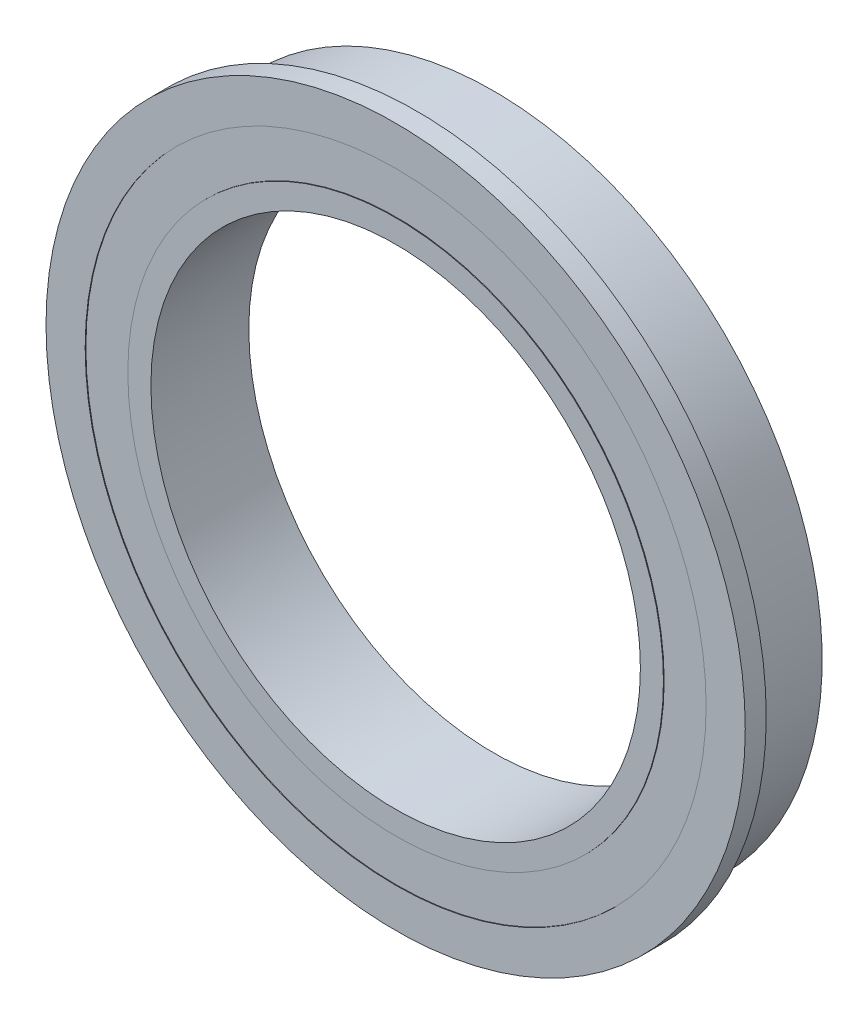
ISO-10303-21;
HEADER;
FILE_DESCRIPTION(('STEP AP214'),'2;1');
FILE_NAME('part.step','',(''),(''),'','','');
FILE_SCHEMA(('AUTOMOTIVE_DESIGN { 1 0 10303 214 1 1 1 1 }'));
ENDSEC;
DATA;
#1=APPLICATION_CONTEXT('core data for automotive mechanical design processes');
#2=APPLICATION_PROTOCOL_DEFINITION('international standard','automotive_design',2000,#1);
#3=PRODUCT_CONTEXT('',#1,'mechanical');
#4=PRODUCT('Part','Part','',(#3));
#5=PRODUCT_RELATED_PRODUCT_CATEGORY('part','',(#4));
#6=PRODUCT_DEFINITION_FORMATION('','',#4);
#7=PRODUCT_DEFINITION_CONTEXT('part definition',#1,'design');
#8=PRODUCT_DEFINITION('design','',#6,#7);
#9=PRODUCT_DEFINITION_SHAPE('','',#8);
#10=(LENGTH_UNIT() NAMED_UNIT(*) SI_UNIT(.MILLI.,.METRE.));
#11=(NAMED_UNIT(*) PLANE_ANGLE_UNIT() SI_UNIT($,.RADIAN.));
#12=(NAMED_UNIT(*) SI_UNIT($,.STERADIAN.) SOLID_ANGLE_UNIT());
#13=UNCERTAINTY_MEASURE_WITH_UNIT(LENGTH_MEASURE(1.E-05),#10,'distance_accuracy_value','');
#14=(GEOMETRIC_REPRESENTATION_CONTEXT(3) GLOBAL_UNCERTAINTY_ASSIGNED_CONTEXT((#13)) GLOBAL_UNIT_ASSIGNED_CONTEXT((#10,
#11,#12)) REPRESENTATION_CONTEXT('',''));
#15=CARTESIAN_POINT('',(0.,0.,0.));
#16=DIRECTION('',(0.,0.,1.));
#17=DIRECTION('',(1.,0.,0.));
#18=AXIS2_PLACEMENT_3D('',#15,#16,#17);
#19=CARTESIAN_POINT('',(0.,0.,0.));
#20=DIRECTION('',(0.,0.,-1.));
#21=DIRECTION('',(-1.,0.,0.));
#22=AXIS2_PLACEMENT_3D('',#19,#20,#21);
#23=CYLINDRICAL_SURFACE('',#22,17.5);
#24=CARTESIAN_POINT('',(0.,0.,7.));
#25=DIRECTION('',(0.,0.,-1.));
#26=DIRECTION('',(-1.,0.,0.));
#27=AXIS2_PLACEMENT_3D('',#24,#25,#26);
#28=CIRCLE('',#27,17.5);
#29=CARTESIAN_POINT('',(-17.5,0.,7.));
#30=VERTEX_POINT('',#29);
#31=EDGE_CURVE('E75',#30,#30,#28,.T.);
#32=ORIENTED_EDGE('',*,*,#31,.F.);
#33=EDGE_LOOP('',(#32));
#34=FACE_BOUND('',#33,.T.);
#35=CARTESIAN_POINT('',(0.,0.,0.));
#36=DIRECTION('',(0.,0.,-1.));
#37=DIRECTION('',(-1.,0.,0.));
#38=AXIS2_PLACEMENT_3D('',#35,#36,#37);
#39=CIRCLE('',#38,17.5);
#40=CARTESIAN_POINT('',(-17.5,0.,0.));
#41=VERTEX_POINT('',#40);
#42=EDGE_CURVE('E10',#41,#41,#39,.T.);
#43=ORIENTED_EDGE('',*,*,#42,.T.);
#44=EDGE_LOOP('',(#43));
#45=FACE_BOUND('',#44,.T.);
#46=ADVANCED_FACE('F15',(#34,#45),#23,.F.);
#47=CARTESIAN_POINT('',(18.325,0.,0.));
#48=DIRECTION('',(0.,0.,1.));
#49=DIRECTION('',(1.,0.,0.));
#50=AXIS2_PLACEMENT_3D('',#47,#48,#49);
#51=PLANE('',#50);
#52=ORIENTED_EDGE('',*,*,#42,.F.);
#53=EDGE_LOOP('',(#52));
#54=FACE_BOUND('',#53,.T.);
#55=CARTESIAN_POINT('',(0.,0.,0.));
#56=DIRECTION('',(0.,0.,-1.));
#57=DIRECTION('',(-1.,0.,0.));
#58=AXIS2_PLACEMENT_3D('',#55,#56,#57);
#59=CIRCLE('',#58,19.15);
#60=CARTESIAN_POINT('',(-19.15,0.,0.));
#61=VERTEX_POINT('',#60);
#62=EDGE_CURVE('E22',#61,#61,#59,.T.);
#63=ORIENTED_EDGE('',*,*,#62,.T.);
#64=EDGE_LOOP('',(#63));
#65=FACE_BOUND('',#64,.T.);
#66=ADVANCED_FACE('F83',(#54,#65),#51,.F.);
#67=CARTESIAN_POINT('',(0.,0.,0.));
#68=DIRECTION('',(0.,0.,-1.));
#69=DIRECTION('',(-1.,0.,0.));
#70=AXIS2_PLACEMENT_3D('',#67,#68,#69);
#71=CYLINDRICAL_SURFACE('',#70,19.15);
#72=ORIENTED_EDGE('',*,*,#62,.F.);
#73=EDGE_LOOP('',(#72));
#74=FACE_BOUND('',#73,.T.);
#75=CARTESIAN_POINT('',(0.,0.,0.0499999999999991));
#76=DIRECTION('',(0.,0.,-1.));
#77=DIRECTION('',(-1.,0.,0.));
#78=AXIS2_PLACEMENT_3D('',#75,#76,#77);
#79=CIRCLE('',#78,19.15);
#80=CARTESIAN_POINT('',(-19.15,0.,0.0499999999999991));
#81=VERTEX_POINT('',#80);
#82=EDGE_CURVE('E30',#81,#81,#79,.T.);
#83=ORIENTED_EDGE('',*,*,#82,.T.);
#84=EDGE_LOOP('',(#83));
#85=FACE_BOUND('',#84,.T.);
#86=ADVANCED_FACE('F87',(#74,#85),#71,.T.);
#87=CARTESIAN_POINT('',(20.675,0.,0.0499999999999993));
#88=DIRECTION('',(0.,0.,1.));
#89=DIRECTION('',(1.,0.,0.));
#90=AXIS2_PLACEMENT_3D('',#87,#88,#89);
#91=PLANE('',#90);
#92=ORIENTED_EDGE('',*,*,#82,.F.);
#93=EDGE_LOOP('',(#92));
#94=FACE_BOUND('',#93,.T.);
#95=CARTESIAN_POINT('',(0.,0.,0.05));
#96=DIRECTION('',(0.,0.,-1.));
#97=DIRECTION('',(-1.,0.,0.));
#98=AXIS2_PLACEMENT_3D('',#95,#96,#97);
#99=CIRCLE('',#98,22.2);
#100=CARTESIAN_POINT('',(-22.2,0.,0.05));
#101=VERTEX_POINT('',#100);
#102=EDGE_CURVE('E36',#101,#101,#99,.T.);
#103=ORIENTED_EDGE('',*,*,#102,.T.);
#104=EDGE_LOOP('',(#103));
#105=FACE_BOUND('',#104,.T.);
#106=ADVANCED_FACE('F91',(#94,#105),#91,.F.);
#107=CARTESIAN_POINT('',(0.,0.,0.));
#108=DIRECTION('',(0.,0.,-1.));
#109=DIRECTION('',(-1.,0.,0.));
#110=AXIS2_PLACEMENT_3D('',#107,#108,#109);
#111=CYLINDRICAL_SURFACE('',#110,22.2);
#112=ORIENTED_EDGE('',*,*,#102,.F.);
#113=EDGE_LOOP('',(#112));
#114=FACE_BOUND('',#113,.T.);
#115=CARTESIAN_POINT('',(0.,0.,0.));
#116=DIRECTION('',(0.,0.,-1.));
#117=DIRECTION('',(-1.,0.,0.));
#118=AXIS2_PLACEMENT_3D('',#115,#116,#117);
#119=CIRCLE('',#118,22.2);
#120=CARTESIAN_POINT('',(-22.2,0.,0.));
#121=VERTEX_POINT('',#120);
#122=EDGE_CURVE('E42',#121,#121,#119,.T.);
#123=ORIENTED_EDGE('',*,*,#122,.T.);
#124=EDGE_LOOP('',(#123));
#125=FACE_BOUND('',#124,.T.);
#126=ADVANCED_FACE('F97',(#114,#125),#111,.F.);
#127=CARTESIAN_POINT('',(22.85,0.,0.));
#128=DIRECTION('',(0.,0.,1.));
#129=DIRECTION('',(1.,0.,0.));
#130=AXIS2_PLACEMENT_3D('',#127,#128,#129);
#131=PLANE('',#130);
#132=ORIENTED_EDGE('',*,*,#122,.F.);
#133=EDGE_LOOP('',(#132));
#134=FACE_BOUND('',#133,.T.);
#135=CARTESIAN_POINT('',(0.,0.,0.));
#136=DIRECTION('',(0.,0.,-1.));
#137=DIRECTION('',(-1.,0.,0.));
#138=AXIS2_PLACEMENT_3D('',#135,#136,#137);
#139=CIRCLE('',#138,23.5);
#140=CARTESIAN_POINT('',(-23.5,0.,0.));
#141=VERTEX_POINT('',#140);
#142=EDGE_CURVE('E46',#141,#141,#139,.T.);
#143=ORIENTED_EDGE('',*,*,#142,.T.);
#144=EDGE_LOOP('',(#143));
#145=FACE_BOUND('',#144,.T.);
#146=ADVANCED_FACE('F101',(#134,#145),#131,.F.);
#147=CARTESIAN_POINT('',(0.,0.,0.));
#148=DIRECTION('',(0.,0.,-1.));
#149=DIRECTION('',(-1.,0.,0.));
#150=AXIS2_PLACEMENT_3D('',#147,#148,#149);
#151=CYLINDRICAL_SURFACE('',#150,23.5);
#152=ORIENTED_EDGE('',*,*,#142,.F.);
#153=EDGE_LOOP('',(#152));
#154=FACE_BOUND('',#153,.T.);
#155=CARTESIAN_POINT('',(0.,0.,5.5));
#156=DIRECTION('',(0.,0.,-1.));
#157=DIRECTION('',(-1.,0.,0.));
#158=AXIS2_PLACEMENT_3D('',#155,#156,#157);
#159=CIRCLE('',#158,23.5);
#160=CARTESIAN_POINT('',(-23.5,0.,5.5));
#161=VERTEX_POINT('',#160);
#162=EDGE_CURVE('E50',#161,#161,#159,.T.);
#163=ORIENTED_EDGE('',*,*,#162,.T.);
#164=EDGE_LOOP('',(#163));
#165=FACE_BOUND('',#164,.T.);
#166=ADVANCED_FACE('F105',(#154,#165),#151,.T.);
#167=CARTESIAN_POINT('',(24.25,0.,5.5));
#168=DIRECTION('',(0.,0.,1.));
#169=DIRECTION('',(1.,0.,0.));
#170=AXIS2_PLACEMENT_3D('',#167,#168,#169);
#171=PLANE('',#170);
#172=ORIENTED_EDGE('',*,*,#162,.F.);
#173=EDGE_LOOP('',(#172));
#174=FACE_BOUND('',#173,.T.);
#175=CARTESIAN_POINT('',(0.,0.,5.5));
#176=DIRECTION('',(0.,0.,-1.));
#177=DIRECTION('',(-1.,0.,0.));
#178=AXIS2_PLACEMENT_3D('',#175,#176,#177);
#179=CIRCLE('',#178,25.);
#180=CARTESIAN_POINT('',(-25.,0.,5.5));
#181=VERTEX_POINT('',#180);
#182=EDGE_CURVE('E54',#181,#181,#179,.T.);
#183=ORIENTED_EDGE('',*,*,#182,.T.);
#184=EDGE_LOOP('',(#183));
#185=FACE_BOUND('',#184,.T.);
#186=ADVANCED_FACE('F109',(#174,#185),#171,.F.);
#187=CARTESIAN_POINT('',(0.,0.,0.));
#188=DIRECTION('',(0.,0.,-1.));
#189=DIRECTION('',(-1.,0.,0.));
#190=AXIS2_PLACEMENT_3D('',#187,#188,#189);
#191=CYLINDRICAL_SURFACE('',#190,25.);
#192=ORIENTED_EDGE('',*,*,#182,.F.);
#193=EDGE_LOOP('',(#192));
#194=FACE_BOUND('',#193,.T.);
#195=CARTESIAN_POINT('',(0.,0.,7.));
#196=DIRECTION('',(0.,0.,-1.));
#197=DIRECTION('',(-1.,0.,0.));
#198=AXIS2_PLACEMENT_3D('',#195,#196,#197);
#199=CIRCLE('',#198,25.);
#200=CARTESIAN_POINT('',(-25.,0.,7.));
#201=VERTEX_POINT('',#200);
#202=EDGE_CURVE('E57',#201,#201,#199,.T.);
#203=ORIENTED_EDGE('',*,*,#202,.T.);
#204=EDGE_LOOP('',(#203));
#205=FACE_BOUND('',#204,.T.);
#206=ADVANCED_FACE('F113',(#194,#205),#191,.T.);
#207=CARTESIAN_POINT('',(23.6,0.,7.));
#208=DIRECTION('',(0.,0.,-1.));
#209=DIRECTION('',(-1.,0.,0.));
#210=AXIS2_PLACEMENT_3D('',#207,#208,#209);
#211=PLANE('',#210);
#212=ORIENTED_EDGE('',*,*,#202,.F.);
#213=EDGE_LOOP('',(#212));
#214=FACE_BOUND('',#213,.T.);
#215=CARTESIAN_POINT('',(0.,0.,7.));
#216=DIRECTION('',(0.,0.,-1.));
#217=DIRECTION('',(-1.,0.,0.));
#218=AXIS2_PLACEMENT_3D('',#215,#216,#217);
#219=CIRCLE('',#218,22.2);
#220=CARTESIAN_POINT('',(-22.2,0.,7.));
#221=VERTEX_POINT('',#220);
#222=EDGE_CURVE('E61',#221,#221,#219,.T.);
#223=ORIENTED_EDGE('',*,*,#222,.T.);
#224=EDGE_LOOP('',(#223));
#225=FACE_BOUND('',#224,.T.);
#226=ADVANCED_FACE('F117',(#214,#225),#211,.F.);
#227=CARTESIAN_POINT('',(0.,0.,0.));
#228=DIRECTION('',(0.,0.,-1.));
#229=DIRECTION('',(-1.,0.,0.));
#230=AXIS2_PLACEMENT_3D('',#227,#228,#229);
#231=CYLINDRICAL_SURFACE('',#230,22.2);
#232=ORIENTED_EDGE('',*,*,#222,.F.);
#233=EDGE_LOOP('',(#232));
#234=FACE_BOUND('',#233,.T.);
#235=CARTESIAN_POINT('',(0.,0.,6.95));
#236=DIRECTION('',(0.,0.,-1.));
#237=DIRECTION('',(-1.,0.,0.));
#238=AXIS2_PLACEMENT_3D('',#235,#236,#237);
#239=CIRCLE('',#238,22.2);
#240=CARTESIAN_POINT('',(-22.2,0.,6.95));
#241=VERTEX_POINT('',#240);
#242=EDGE_CURVE('E64',#241,#241,#239,.T.);
#243=ORIENTED_EDGE('',*,*,#242,.T.);
#244=EDGE_LOOP('',(#243));
#245=FACE_BOUND('',#244,.T.);
#246=ADVANCED_FACE('F121',(#234,#245),#231,.F.);
#247=CARTESIAN_POINT('',(20.675,0.,6.95));
#248=DIRECTION('',(0.,0.,-1.));
#249=DIRECTION('',(-1.,0.,0.));
#250=AXIS2_PLACEMENT_3D('',#247,#248,#249);
#251=PLANE('',#250);
#252=ORIENTED_EDGE('',*,*,#242,.F.);
#253=EDGE_LOOP('',(#252));
#254=FACE_BOUND('',#253,.T.);
#255=CARTESIAN_POINT('',(0.,0.,6.95));
#256=DIRECTION('',(0.,0.,-1.));
#257=DIRECTION('',(-1.,0.,0.));
#258=AXIS2_PLACEMENT_3D('',#255,#256,#257);
#259=CIRCLE('',#258,19.15);
#260=CARTESIAN_POINT('',(-19.15,0.,6.95));
#261=VERTEX_POINT('',#260);
#262=EDGE_CURVE('E67',#261,#261,#259,.T.);
#263=ORIENTED_EDGE('',*,*,#262,.T.);
#264=EDGE_LOOP('',(#263));
#265=FACE_BOUND('',#264,.T.);
#266=ADVANCED_FACE('F125',(#254,#265),#251,.F.);
#267=CARTESIAN_POINT('',(0.,0.,0.));
#268=DIRECTION('',(0.,0.,-1.));
#269=DIRECTION('',(-1.,0.,0.));
#270=AXIS2_PLACEMENT_3D('',#267,#268,#269);
#271=CYLINDRICAL_SURFACE('',#270,19.15);
#272=ORIENTED_EDGE('',*,*,#262,.F.);
#273=EDGE_LOOP('',(#272));
#274=FACE_BOUND('',#273,.T.);
#275=CARTESIAN_POINT('',(0.,0.,7.));
#276=DIRECTION('',(0.,0.,-1.));
#277=DIRECTION('',(-1.,0.,0.));
#278=AXIS2_PLACEMENT_3D('',#275,#276,#277);
#279=CIRCLE('',#278,19.15);
#280=CARTESIAN_POINT('',(-19.15,0.,7.));
#281=VERTEX_POINT('',#280);
#282=EDGE_CURVE('E71',#281,#281,#279,.T.);
#283=ORIENTED_EDGE('',*,*,#282,.T.);
#284=EDGE_LOOP('',(#283));
#285=FACE_BOUND('',#284,.T.);
#286=ADVANCED_FACE('F129',(#274,#285),#271,.T.);
#287=CARTESIAN_POINT('',(18.325,0.,7.));
#288=DIRECTION('',(0.,0.,-1.));
#289=DIRECTION('',(-1.,0.,0.));
#290=AXIS2_PLACEMENT_3D('',#287,#288,#289);
#291=PLANE('',#290);
#292=ORIENTED_EDGE('',*,*,#282,.F.);
#293=EDGE_LOOP('',(#292));
#294=FACE_BOUND('',#293,.T.);
#295=ORIENTED_EDGE('',*,*,#31,.T.);
#296=EDGE_LOOP('',(#295));
#297=FACE_BOUND('',#296,.T.);
#298=ADVANCED_FACE('F80',(#294,#297),#291,.F.);
#299=CLOSED_SHELL('',(#46,#66,#86,#106,#126,#146,#166,#186,#206,#226,#246,#266,#286,#298));
#300=MANIFOLD_SOLID_BREP('B1',#299);
#301=ADVANCED_BREP_SHAPE_REPRESENTATION('',(#18,#300),#14);
#302=SHAPE_DEFINITION_REPRESENTATION(#9,#301);
ENDSEC;
END-ISO-10303-21;
